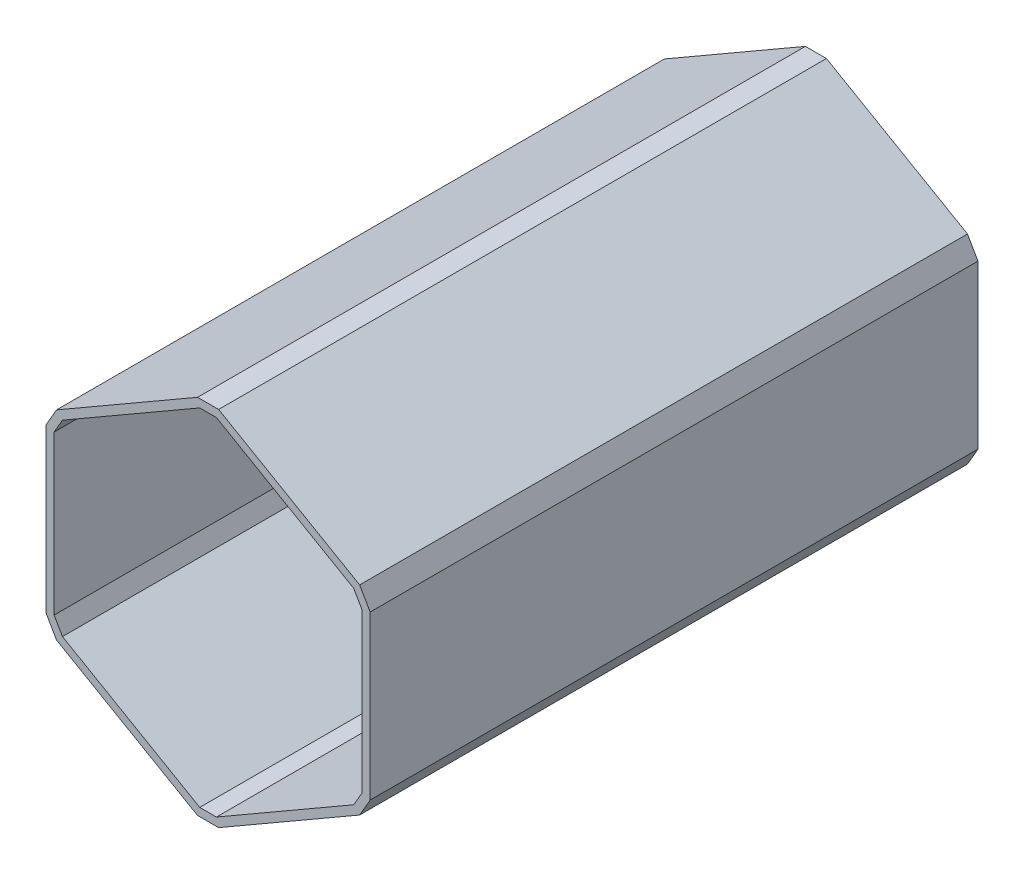
ISO-10303-21;
HEADER;
FILE_DESCRIPTION(('STEP AP214'),'2;1');
FILE_NAME('part.step','',(''),(''),'','','');
FILE_SCHEMA(('AUTOMOTIVE_DESIGN { 1 0 10303 214 1 1 1 1 }'));
ENDSEC;
DATA;
#1=APPLICATION_CONTEXT('core data for automotive mechanical design processes');
#2=APPLICATION_PROTOCOL_DEFINITION('international standard','automotive_design',2000,#1);
#3=PRODUCT_CONTEXT('',#1,'mechanical');
#4=PRODUCT('Part','Part','',(#3));
#5=PRODUCT_RELATED_PRODUCT_CATEGORY('part','',(#4));
#6=PRODUCT_DEFINITION_FORMATION('','',#4);
#7=PRODUCT_DEFINITION_CONTEXT('part definition',#1,'design');
#8=PRODUCT_DEFINITION('design','',#6,#7);
#9=PRODUCT_DEFINITION_SHAPE('','',#8);
#10=(LENGTH_UNIT() NAMED_UNIT(*) SI_UNIT(.MILLI.,.METRE.));
#11=(NAMED_UNIT(*) PLANE_ANGLE_UNIT() SI_UNIT($,.RADIAN.));
#12=(NAMED_UNIT(*) SI_UNIT($,.STERADIAN.) SOLID_ANGLE_UNIT());
#13=UNCERTAINTY_MEASURE_WITH_UNIT(LENGTH_MEASURE(1.E-05),#10,'distance_accuracy_value','');
#14=(GEOMETRIC_REPRESENTATION_CONTEXT(3) GLOBAL_UNCERTAINTY_ASSIGNED_CONTEXT((#13)) GLOBAL_UNIT_ASSIGNED_CONTEXT((#10,
#11,#12)) REPRESENTATION_CONTEXT('',''));
#15=CARTESIAN_POINT('',(0.,0.,0.));
#16=DIRECTION('',(0.,0.,1.));
#17=DIRECTION('',(1.,0.,0.));
#18=AXIS2_PLACEMENT_3D('',#15,#16,#17);
#19=CARTESIAN_POINT('',(0.,0.,150.));
#20=DIRECTION('',(0.,0.,1.));
#21=DIRECTION('',(1.,0.,0.));
#22=AXIS2_PLACEMENT_3D('',#19,#20,#21);
#23=PLANE('',#22);
#24=DIRECTION('',(-0.866025403784439,0.499999999999999,0.));
#25=VECTOR('',#24,1.);
#26=CARTESIAN_POINT('',(37.4019237886467,24.5940107675851,150.));
#27=LINE('',#26,#25);
#28=CARTESIAN_POINT('',(37.4019237886467,24.5940107675851,150.));
#29=VERTEX_POINT('',#28);
#30=CARTESIAN_POINT('',(2.59807621135332,44.6880215351701,150.));
#31=VERTEX_POINT('',#30);
#32=EDGE_CURVE('E288',#29,#31,#27,.T.);
#33=ORIENTED_EDGE('',*,*,#32,.T.);
#34=DIRECTION('',(-1.,0.,0.));
#35=VECTOR('',#34,1.);
#36=CARTESIAN_POINT('',(2.59807621135332,44.6880215351701,150.));
#37=LINE('',#36,#35);
#38=CARTESIAN_POINT('',(-2.59807621135332,44.6880215351701,150.));
#39=VERTEX_POINT('',#38);
#40=EDGE_CURVE('E291',#31,#39,#37,.T.);
#41=ORIENTED_EDGE('',*,*,#40,.T.);
#42=DIRECTION('',(-0.866025403784439,-0.5,0.));
#43=VECTOR('',#42,1.);
#44=CARTESIAN_POINT('',(-2.59807621135332,44.6880215351701,150.));
#45=LINE('',#44,#43);
#46=CARTESIAN_POINT('',(-37.4019237886467,24.5940107675851,150.));
#47=VERTEX_POINT('',#46);
#48=EDGE_CURVE('E294',#39,#47,#45,.T.);
#49=ORIENTED_EDGE('',*,*,#48,.T.);
#50=DIRECTION('',(-0.5,-0.866025403784439,0.));
#51=VECTOR('',#50,1.);
#52=CARTESIAN_POINT('',(-37.4019237886467,24.5940107675851,150.));
#53=LINE('',#52,#51);
#54=CARTESIAN_POINT('',(-40.,20.0940107675851,150.));
#55=VERTEX_POINT('',#54);
#56=EDGE_CURVE('E296',#47,#55,#53,.T.);
#57=ORIENTED_EDGE('',*,*,#56,.T.);
#58=DIRECTION('',(0.,-1.,0.));
#59=VECTOR('',#58,1.);
#60=CARTESIAN_POINT('',(-40.,20.0940107675851,150.));
#61=LINE('',#60,#59);
#62=CARTESIAN_POINT('',(-40.,-20.094010767585,150.));
#63=VERTEX_POINT('',#62);
#64=EDGE_CURVE('E298',#55,#63,#61,.T.);
#65=ORIENTED_EDGE('',*,*,#64,.T.);
#66=DIRECTION('',(0.5,-0.866025403784439,0.));
#67=VECTOR('',#66,1.);
#68=CARTESIAN_POINT('',(-40.,-20.094010767585,150.));
#69=LINE('',#68,#67);
#70=CARTESIAN_POINT('',(-37.4019237886467,-24.594010767585,150.));
#71=VERTEX_POINT('',#70);
#72=EDGE_CURVE('E300',#63,#71,#69,.T.);
#73=ORIENTED_EDGE('',*,*,#72,.T.);
#74=DIRECTION('',(0.866025403784439,-0.5,0.));
#75=VECTOR('',#74,1.);
#76=CARTESIAN_POINT('',(-37.4019237886467,-24.594010767585,150.));
#77=LINE('',#76,#75);
#78=CARTESIAN_POINT('',(-2.59807621135333,-44.6880215351701,150.));
#79=VERTEX_POINT('',#78);
#80=EDGE_CURVE('E302',#71,#79,#77,.T.);
#81=ORIENTED_EDGE('',*,*,#80,.T.);
#82=DIRECTION('',(1.,0.,0.));
#83=VECTOR('',#82,1.);
#84=CARTESIAN_POINT('',(-2.59807621135333,-44.6880215351701,150.));
#85=LINE('',#84,#83);
#86=CARTESIAN_POINT('',(2.59807621135331,-44.6880215351701,150.));
#87=VERTEX_POINT('',#86);
#88=EDGE_CURVE('E304',#79,#87,#85,.T.);
#89=ORIENTED_EDGE('',*,*,#88,.T.);
#90=DIRECTION('',(0.866025403784439,0.5,0.));
#91=VECTOR('',#90,1.);
#92=CARTESIAN_POINT('',(2.59807621135331,-44.6880215351701,150.));
#93=LINE('',#92,#91);
#94=CARTESIAN_POINT('',(37.4019237886467,-24.5940107675851,150.));
#95=VERTEX_POINT('',#94);
#96=EDGE_CURVE('E306',#87,#95,#93,.T.);
#97=ORIENTED_EDGE('',*,*,#96,.T.);
#98=DIRECTION('',(0.5,0.866025403784439,0.));
#99=VECTOR('',#98,1.);
#100=CARTESIAN_POINT('',(37.4019237886467,-24.5940107675851,150.));
#101=LINE('',#100,#99);
#102=CARTESIAN_POINT('',(40.,-20.0940107675851,150.));
#103=VERTEX_POINT('',#102);
#104=EDGE_CURVE('E308',#95,#103,#101,.T.);
#105=ORIENTED_EDGE('',*,*,#104,.T.);
#106=DIRECTION('',(0.,1.,0.));
#107=VECTOR('',#106,1.);
#108=CARTESIAN_POINT('',(40.,-20.0940107675851,150.));
#109=LINE('',#108,#107);
#110=CARTESIAN_POINT('',(40.,20.0940107675851,150.));
#111=VERTEX_POINT('',#110);
#112=EDGE_CURVE('E310',#103,#111,#109,.T.);
#113=ORIENTED_EDGE('',*,*,#112,.T.);
#114=DIRECTION('',(-0.5,0.866025403784439,0.));
#115=VECTOR('',#114,1.);
#116=CARTESIAN_POINT('',(40.,20.0940107675851,150.));
#117=LINE('',#116,#115);
#118=EDGE_CURVE('E312',#111,#29,#117,.T.);
#119=ORIENTED_EDGE('',*,*,#118,.T.);
#120=EDGE_LOOP('',(#33,#41,#49,#57,#65,#73,#81,#89,#97,#105,#113,#119));
#121=FACE_BOUND('',#120,.T.);
#122=DIRECTION('',(-0.866025403784439,-0.5,0.));
#123=VECTOR('',#122,1.);
#124=CARTESIAN_POINT('',(-2.06217782649109,42.68802153517,150.));
#125=LINE('',#124,#123);
#126=CARTESIAN_POINT('',(-2.06217782649109,42.68802153517,150.));
#127=VERTEX_POINT('',#126);
#128=CARTESIAN_POINT('',(-35.937822173509,23.1299091524473,150.));
#129=VERTEX_POINT('',#128);
#130=EDGE_CURVE('E203',#127,#129,#125,.T.);
#131=ORIENTED_EDGE('',*,*,#130,.F.);
#132=DIRECTION('',(-1.,0.,0.));
#133=VECTOR('',#132,1.);
#134=CARTESIAN_POINT('',(2.06217782649112,42.68802153517,150.));
#135=LINE('',#134,#133);
#136=CARTESIAN_POINT('',(2.06217782649112,42.68802153517,150.));
#137=VERTEX_POINT('',#136);
#138=EDGE_CURVE('E195',#137,#127,#135,.T.);
#139=ORIENTED_EDGE('',*,*,#138,.F.);
#140=DIRECTION('',(-0.866025403784439,0.5,0.));
#141=VECTOR('',#140,1.);
#142=CARTESIAN_POINT('',(35.9378221735089,23.1299091524473,150.));
#143=LINE('',#142,#141);
#144=CARTESIAN_POINT('',(35.9378221735089,23.1299091524473,150.));
#145=VERTEX_POINT('',#144);
#146=EDGE_CURVE('E236',#145,#137,#143,.T.);
#147=ORIENTED_EDGE('',*,*,#146,.F.);
#148=DIRECTION('',(-0.5,0.866025403784439,0.));
#149=VECTOR('',#148,1.);
#150=CARTESIAN_POINT('',(38.,19.5581123827228,150.));
#151=LINE('',#150,#149);
#152=CARTESIAN_POINT('',(38.,19.5581123827228,150.));
#153=VERTEX_POINT('',#152);
#154=EDGE_CURVE('E234',#153,#145,#151,.T.);
#155=ORIENTED_EDGE('',*,*,#154,.F.);
#156=DIRECTION('',(0.,1.,0.));
#157=VECTOR('',#156,1.);
#158=CARTESIAN_POINT('',(38.,-19.5581123827228,150.));
#159=LINE('',#158,#157);
#160=CARTESIAN_POINT('',(38.,-19.5581123827228,150.));
#161=VERTEX_POINT('',#160);
#162=EDGE_CURVE('E232',#161,#153,#159,.T.);
#163=ORIENTED_EDGE('',*,*,#162,.F.);
#164=DIRECTION('',(0.5,0.866025403784439,0.));
#165=VECTOR('',#164,1.);
#166=CARTESIAN_POINT('',(35.9378221735089,-23.1299091524473,150.));
#167=LINE('',#166,#165);
#168=CARTESIAN_POINT('',(35.9378221735089,-23.1299091524473,150.));
#169=VERTEX_POINT('',#168);
#170=EDGE_CURVE('E230',#169,#161,#167,.T.);
#171=ORIENTED_EDGE('',*,*,#170,.F.);
#172=DIRECTION('',(0.866025403784438,0.5,0.));
#173=VECTOR('',#172,1.);
#174=CARTESIAN_POINT('',(2.06217782649106,-42.6880215351701,150.));
#175=LINE('',#174,#173);
#176=CARTESIAN_POINT('',(2.06217782649106,-42.6880215351701,150.));
#177=VERTEX_POINT('',#176);
#178=EDGE_CURVE('E228',#177,#169,#175,.T.);
#179=ORIENTED_EDGE('',*,*,#178,.F.);
#180=DIRECTION('',(1.,0.,0.));
#181=VECTOR('',#180,1.);
#182=CARTESIAN_POINT('',(-2.06217782649108,-42.6880215351701,150.));
#183=LINE('',#182,#181);
#184=CARTESIAN_POINT('',(-2.06217782649108,-42.6880215351701,150.));
#185=VERTEX_POINT('',#184);
#186=EDGE_CURVE('E226',#185,#177,#183,.T.);
#187=ORIENTED_EDGE('',*,*,#186,.F.);
#188=DIRECTION('',(0.866025403784439,-0.5,0.));
#189=VECTOR('',#188,1.);
#190=CARTESIAN_POINT('',(-35.9378221735089,-23.1299091524473,150.));
#191=LINE('',#190,#189);
#192=CARTESIAN_POINT('',(-35.9378221735089,-23.1299091524473,150.));
#193=VERTEX_POINT('',#192);
#194=EDGE_CURVE('E224',#193,#185,#191,.T.);
#195=ORIENTED_EDGE('',*,*,#194,.F.);
#196=DIRECTION('',(0.5,-0.866025403784439,0.));
#197=VECTOR('',#196,1.);
#198=CARTESIAN_POINT('',(-38.,-19.5581123827228,150.));
#199=LINE('',#198,#197);
#200=CARTESIAN_POINT('',(-38.,-19.5581123827228,150.));
#201=VERTEX_POINT('',#200);
#202=EDGE_CURVE('E222',#201,#193,#199,.T.);
#203=ORIENTED_EDGE('',*,*,#202,.F.);
#204=DIRECTION('',(0.,-1.,0.));
#205=VECTOR('',#204,1.);
#206=CARTESIAN_POINT('',(-38.,19.5581123827228,150.));
#207=LINE('',#206,#205);
#208=CARTESIAN_POINT('',(-38.,19.5581123827228,150.));
#209=VERTEX_POINT('',#208);
#210=EDGE_CURVE('E218',#209,#201,#207,.T.);
#211=ORIENTED_EDGE('',*,*,#210,.F.);
#212=DIRECTION('',(-0.5,-0.866025403784439,0.));
#213=VECTOR('',#212,1.);
#214=CARTESIAN_POINT('',(-35.937822173509,23.1299091524473,150.));
#215=LINE('',#214,#213);
#216=EDGE_CURVE('E216',#129,#209,#215,.T.);
#217=ORIENTED_EDGE('',*,*,#216,.F.);
#218=EDGE_LOOP('',(#131,#139,#147,#155,#163,#171,#179,#187,#195,#203,#211,#217));
#219=FACE_BOUND('',#218,.T.);
#220=ADVANCED_FACE('F34',(#121,#219),#23,.T.);
#221=CARTESIAN_POINT('',(0.,0.,0.));
#222=DIRECTION('',(0.,0.,1.));
#223=DIRECTION('',(1.,0.,0.));
#224=AXIS2_PLACEMENT_3D('',#221,#222,#223);
#225=PLANE('',#224);
#226=DIRECTION('',(-0.866025403784439,0.499999999999999,0.));
#227=VECTOR('',#226,1.);
#228=CARTESIAN_POINT('',(37.4019237886467,24.5940107675851,0.));
#229=LINE('',#228,#227);
#230=CARTESIAN_POINT('',(37.4019237886467,24.5940107675851,0.));
#231=VERTEX_POINT('',#230);
#232=CARTESIAN_POINT('',(2.59807621135332,44.6880215351701,0.));
#233=VERTEX_POINT('',#232);
#234=EDGE_CURVE('E211',#231,#233,#229,.T.);
#235=ORIENTED_EDGE('',*,*,#234,.F.);
#236=DIRECTION('',(-0.5,0.866025403784439,0.));
#237=VECTOR('',#236,1.);
#238=CARTESIAN_POINT('',(40.,20.0940107675851,0.));
#239=LINE('',#238,#237);
#240=CARTESIAN_POINT('',(40.,20.0940107675851,0.));
#241=VERTEX_POINT('',#240);
#242=EDGE_CURVE('E292',#241,#231,#239,.T.);
#243=ORIENTED_EDGE('',*,*,#242,.F.);
#244=DIRECTION('',(0.,1.,0.));
#245=VECTOR('',#244,1.);
#246=CARTESIAN_POINT('',(40.,-20.0940107675851,0.));
#247=LINE('',#246,#245);
#248=CARTESIAN_POINT('',(40.,-20.0940107675851,0.));
#249=VERTEX_POINT('',#248);
#250=EDGE_CURVE('E335',#249,#241,#247,.T.);
#251=ORIENTED_EDGE('',*,*,#250,.F.);
#252=DIRECTION('',(0.5,0.866025403784439,0.));
#253=VECTOR('',#252,1.);
#254=CARTESIAN_POINT('',(37.4019237886467,-24.5940107675851,0.));
#255=LINE('',#254,#253);
#256=CARTESIAN_POINT('',(37.4019237886467,-24.5940107675851,0.));
#257=VERTEX_POINT('',#256);
#258=EDGE_CURVE('E333',#257,#249,#255,.T.);
#259=ORIENTED_EDGE('',*,*,#258,.F.);
#260=DIRECTION('',(0.866025403784439,0.5,0.));
#261=VECTOR('',#260,1.);
#262=CARTESIAN_POINT('',(2.59807621135331,-44.6880215351701,0.));
#263=LINE('',#262,#261);
#264=CARTESIAN_POINT('',(2.59807621135331,-44.6880215351701,0.));
#265=VERTEX_POINT('',#264);
#266=EDGE_CURVE('E331',#265,#257,#263,.T.);
#267=ORIENTED_EDGE('',*,*,#266,.F.);
#268=DIRECTION('',(1.,0.,0.));
#269=VECTOR('',#268,1.);
#270=CARTESIAN_POINT('',(-2.59807621135333,-44.6880215351701,0.));
#271=LINE('',#270,#269);
#272=CARTESIAN_POINT('',(-2.59807621135333,-44.6880215351701,0.));
#273=VERTEX_POINT('',#272);
#274=EDGE_CURVE('E329',#273,#265,#271,.T.);
#275=ORIENTED_EDGE('',*,*,#274,.F.);
#276=DIRECTION('',(0.866025403784439,-0.5,0.));
#277=VECTOR('',#276,1.);
#278=CARTESIAN_POINT('',(-37.4019237886467,-24.594010767585,0.));
#279=LINE('',#278,#277);
#280=CARTESIAN_POINT('',(-37.4019237886467,-24.594010767585,0.));
#281=VERTEX_POINT('',#280);
#282=EDGE_CURVE('E327',#281,#273,#279,.T.);
#283=ORIENTED_EDGE('',*,*,#282,.F.);
#284=DIRECTION('',(0.5,-0.866025403784439,0.));
#285=VECTOR('',#284,1.);
#286=CARTESIAN_POINT('',(-40.,-20.094010767585,0.));
#287=LINE('',#286,#285);
#288=CARTESIAN_POINT('',(-40.,-20.094010767585,0.));
#289=VERTEX_POINT('',#288);
#290=EDGE_CURVE('E325',#289,#281,#287,.T.);
#291=ORIENTED_EDGE('',*,*,#290,.F.);
#292=DIRECTION('',(0.,-1.,0.));
#293=VECTOR('',#292,1.);
#294=CARTESIAN_POINT('',(-40.,20.0940107675851,0.));
#295=LINE('',#294,#293);
#296=CARTESIAN_POINT('',(-40.,20.0940107675851,0.));
#297=VERTEX_POINT('',#296);
#298=EDGE_CURVE('E323',#297,#289,#295,.T.);
#299=ORIENTED_EDGE('',*,*,#298,.F.);
#300=DIRECTION('',(-0.5,-0.866025403784439,0.));
#301=VECTOR('',#300,1.);
#302=CARTESIAN_POINT('',(-37.4019237886467,24.5940107675851,0.));
#303=LINE('',#302,#301);
#304=CARTESIAN_POINT('',(-37.4019237886467,24.5940107675851,0.));
#305=VERTEX_POINT('',#304);
#306=EDGE_CURVE('E321',#305,#297,#303,.T.);
#307=ORIENTED_EDGE('',*,*,#306,.F.);
#308=DIRECTION('',(-0.866025403784439,-0.5,0.));
#309=VECTOR('',#308,1.);
#310=CARTESIAN_POINT('',(-2.59807621135332,44.6880215351701,0.));
#311=LINE('',#310,#309);
#312=CARTESIAN_POINT('',(-2.59807621135332,44.6880215351701,0.));
#313=VERTEX_POINT('',#312);
#314=EDGE_CURVE('E319',#313,#305,#311,.T.);
#315=ORIENTED_EDGE('',*,*,#314,.F.);
#316=DIRECTION('',(-1.,0.,0.));
#317=VECTOR('',#316,1.);
#318=CARTESIAN_POINT('',(2.59807621135332,44.6880215351701,0.));
#319=LINE('',#318,#317);
#320=EDGE_CURVE('E317',#233,#313,#319,.T.);
#321=ORIENTED_EDGE('',*,*,#320,.F.);
#322=EDGE_LOOP('',(#235,#243,#251,#259,#267,#275,#283,#291,#299,#307,#315,#321));
#323=FACE_BOUND('',#322,.T.);
#324=DIRECTION('',(-1.,0.,0.));
#325=VECTOR('',#324,1.);
#326=CARTESIAN_POINT('',(2.06217782649112,42.68802153517,0.));
#327=LINE('',#326,#325);
#328=CARTESIAN_POINT('',(2.06217782649112,42.68802153517,0.));
#329=VERTEX_POINT('',#328);
#330=CARTESIAN_POINT('',(-2.06217782649109,42.68802153517,0.));
#331=VERTEX_POINT('',#330);
#332=EDGE_CURVE('E57',#329,#331,#327,.T.);
#333=ORIENTED_EDGE('',*,*,#332,.T.);
#334=DIRECTION('',(-0.866025403784439,-0.5,0.));
#335=VECTOR('',#334,1.);
#336=CARTESIAN_POINT('',(-2.06217782649109,42.68802153517,0.));
#337=LINE('',#336,#335);
#338=CARTESIAN_POINT('',(-35.937822173509,23.1299091524473,0.));
#339=VERTEX_POINT('',#338);
#340=EDGE_CURVE('E210',#331,#339,#337,.T.);
#341=ORIENTED_EDGE('',*,*,#340,.T.);
#342=DIRECTION('',(-0.5,-0.866025403784439,0.));
#343=VECTOR('',#342,1.);
#344=CARTESIAN_POINT('',(-35.937822173509,23.1299091524473,0.));
#345=LINE('',#344,#343);
#346=CARTESIAN_POINT('',(-38.,19.5581123827228,0.));
#347=VERTEX_POINT('',#346);
#348=EDGE_CURVE('E240',#339,#347,#345,.T.);
#349=ORIENTED_EDGE('',*,*,#348,.T.);
#350=DIRECTION('',(0.,-1.,0.));
#351=VECTOR('',#350,1.);
#352=CARTESIAN_POINT('',(-38.,19.5581123827228,0.));
#353=LINE('',#352,#351);
#354=CARTESIAN_POINT('',(-38.,-19.5581123827228,0.));
#355=VERTEX_POINT('',#354);
#356=EDGE_CURVE('E243',#347,#355,#353,.T.);
#357=ORIENTED_EDGE('',*,*,#356,.T.);
#358=DIRECTION('',(0.5,-0.866025403784439,0.));
#359=VECTOR('',#358,1.);
#360=CARTESIAN_POINT('',(-38.,-19.5581123827228,0.));
#361=LINE('',#360,#359);
#362=CARTESIAN_POINT('',(-35.9378221735089,-23.1299091524473,0.));
#363=VERTEX_POINT('',#362);
#364=EDGE_CURVE('E246',#355,#363,#361,.T.);
#365=ORIENTED_EDGE('',*,*,#364,.T.);
#366=DIRECTION('',(0.866025403784439,-0.5,0.));
#367=VECTOR('',#366,1.);
#368=CARTESIAN_POINT('',(-35.9378221735089,-23.1299091524473,0.));
#369=LINE('',#368,#367);
#370=CARTESIAN_POINT('',(-2.06217782649108,-42.6880215351701,0.));
#371=VERTEX_POINT('',#370);
#372=EDGE_CURVE('E249',#363,#371,#369,.T.);
#373=ORIENTED_EDGE('',*,*,#372,.T.);
#374=DIRECTION('',(1.,0.,0.));
#375=VECTOR('',#374,1.);
#376=CARTESIAN_POINT('',(-2.06217782649108,-42.6880215351701,0.));
#377=LINE('',#376,#375);
#378=CARTESIAN_POINT('',(2.06217782649106,-42.6880215351701,0.));
#379=VERTEX_POINT('',#378);
#380=EDGE_CURVE('E252',#371,#379,#377,.T.);
#381=ORIENTED_EDGE('',*,*,#380,.T.);
#382=DIRECTION('',(0.866025403784438,0.5,0.));
#383=VECTOR('',#382,1.);
#384=CARTESIAN_POINT('',(2.06217782649106,-42.6880215351701,0.));
#385=LINE('',#384,#383);
#386=CARTESIAN_POINT('',(35.9378221735089,-23.1299091524473,0.));
#387=VERTEX_POINT('',#386);
#388=EDGE_CURVE('E255',#379,#387,#385,.T.);
#389=ORIENTED_EDGE('',*,*,#388,.T.);
#390=DIRECTION('',(0.5,0.866025403784439,0.));
#391=VECTOR('',#390,1.);
#392=CARTESIAN_POINT('',(35.9378221735089,-23.1299091524473,0.));
#393=LINE('',#392,#391);
#394=CARTESIAN_POINT('',(38.,-19.5581123827228,0.));
#395=VERTEX_POINT('',#394);
#396=EDGE_CURVE('E258',#387,#395,#393,.T.);
#397=ORIENTED_EDGE('',*,*,#396,.T.);
#398=DIRECTION('',(0.,1.,0.));
#399=VECTOR('',#398,1.);
#400=CARTESIAN_POINT('',(38.,-19.5581123827228,0.));
#401=LINE('',#400,#399);
#402=CARTESIAN_POINT('',(38.,19.5581123827228,0.));
#403=VERTEX_POINT('',#402);
#404=EDGE_CURVE('E261',#395,#403,#401,.T.);
#405=ORIENTED_EDGE('',*,*,#404,.T.);
#406=DIRECTION('',(-0.5,0.866025403784439,0.));
#407=VECTOR('',#406,1.);
#408=CARTESIAN_POINT('',(38.,19.5581123827228,0.));
#409=LINE('',#408,#407);
#410=CARTESIAN_POINT('',(35.9378221735089,23.1299091524473,0.));
#411=VERTEX_POINT('',#410);
#412=EDGE_CURVE('E264',#403,#411,#409,.T.);
#413=ORIENTED_EDGE('',*,*,#412,.T.);
#414=DIRECTION('',(-0.866025403784439,0.5,0.));
#415=VECTOR('',#414,1.);
#416=CARTESIAN_POINT('',(35.9378221735089,23.1299091524473,0.));
#417=LINE('',#416,#415);
#418=EDGE_CURVE('E204',#411,#329,#417,.T.);
#419=ORIENTED_EDGE('',*,*,#418,.T.);
#420=EDGE_LOOP('',(#333,#341,#349,#357,#365,#373,#381,#389,#397,#405,#413,#419));
#421=FACE_BOUND('',#420,.T.);
#422=ADVANCED_FACE('F377',(#323,#421),#225,.F.);
#423=CARTESIAN_POINT('',(37.4019237886467,24.5940107675851,150.));
#424=DIRECTION('',(-0.499999999999999,-0.866025403784439,0.));
#425=DIRECTION('',(0.866025403784439,-0.5,0.));
#426=AXIS2_PLACEMENT_3D('',#423,#424,#425);
#427=PLANE('',#426);
#428=ORIENTED_EDGE('',*,*,#234,.T.);
#429=DIRECTION('',(0.,0.,-1.));
#430=VECTOR('',#429,1.);
#431=CARTESIAN_POINT('',(2.59807621135332,44.6880215351701,150.));
#432=LINE('',#431,#430);
#433=EDGE_CURVE('E11',#31,#233,#432,.T.);
#434=ORIENTED_EDGE('',*,*,#433,.F.);
#435=ORIENTED_EDGE('',*,*,#32,.F.);
#436=DIRECTION('',(0.,0.,-1.));
#437=VECTOR('',#436,1.);
#438=CARTESIAN_POINT('',(37.4019237886467,24.5940107675851,150.));
#439=LINE('',#438,#437);
#440=EDGE_CURVE('E314',#29,#231,#439,.T.);
#441=ORIENTED_EDGE('',*,*,#440,.T.);
#442=EDGE_LOOP('',(#428,#434,#435,#441));
#443=FACE_BOUND('',#442,.T.);
#444=ADVANCED_FACE('F36',(#443),#427,.F.);
#445=CARTESIAN_POINT('',(2.59807621135332,44.6880215351701,150.));
#446=DIRECTION('',(0.,-1.,0.));
#447=DIRECTION('',(1.,0.,0.));
#448=AXIS2_PLACEMENT_3D('',#445,#446,#447);
#449=PLANE('',#448);
#450=ORIENTED_EDGE('',*,*,#320,.T.);
#451=DIRECTION('',(0.,0.,-1.));
#452=VECTOR('',#451,1.);
#453=CARTESIAN_POINT('',(-2.59807621135332,44.6880215351701,150.));
#454=LINE('',#453,#452);
#455=EDGE_CURVE('E42',#39,#313,#454,.T.);
#456=ORIENTED_EDGE('',*,*,#455,.F.);
#457=ORIENTED_EDGE('',*,*,#40,.F.);
#458=ORIENTED_EDGE('',*,*,#433,.T.);
#459=EDGE_LOOP('',(#450,#456,#457,#458));
#460=FACE_BOUND('',#459,.T.);
#461=ADVANCED_FACE('F394',(#460),#449,.F.);
#462=CARTESIAN_POINT('',(-2.59807621135332,44.6880215351701,150.));
#463=DIRECTION('',(0.5,-0.866025403784439,0.));
#464=DIRECTION('',(0.866025403784439,0.5,0.));
#465=AXIS2_PLACEMENT_3D('',#462,#463,#464);
#466=PLANE('',#465);
#467=ORIENTED_EDGE('',*,*,#314,.T.);
#468=DIRECTION('',(0.,0.,-1.));
#469=VECTOR('',#468,1.);
#470=CARTESIAN_POINT('',(-37.4019237886467,24.5940107675851,150.));
#471=LINE('',#470,#469);
#472=EDGE_CURVE('E364',#47,#305,#471,.T.);
#473=ORIENTED_EDGE('',*,*,#472,.F.);
#474=ORIENTED_EDGE('',*,*,#48,.F.);
#475=ORIENTED_EDGE('',*,*,#455,.T.);
#476=EDGE_LOOP('',(#467,#473,#474,#475));
#477=FACE_BOUND('',#476,.T.);
#478=ADVANCED_FACE('F371',(#477),#466,.F.);
#479=CARTESIAN_POINT('',(-37.4019237886467,24.5940107675851,150.));
#480=DIRECTION('',(0.866025403784439,-0.5,0.));
#481=DIRECTION('',(0.5,0.866025403784439,0.));
#482=AXIS2_PLACEMENT_3D('',#479,#480,#481);
#483=PLANE('',#482);
#484=ORIENTED_EDGE('',*,*,#306,.T.);
#485=DIRECTION('',(0.,0.,-1.));
#486=VECTOR('',#485,1.);
#487=CARTESIAN_POINT('',(-40.,20.0940107675851,150.));
#488=LINE('',#487,#486);
#489=EDGE_CURVE('E361',#55,#297,#488,.T.);
#490=ORIENTED_EDGE('',*,*,#489,.F.);
#491=ORIENTED_EDGE('',*,*,#56,.F.);
#492=ORIENTED_EDGE('',*,*,#472,.T.);
#493=EDGE_LOOP('',(#484,#490,#491,#492));
#494=FACE_BOUND('',#493,.T.);
#495=ADVANCED_FACE('F383',(#494),#483,.F.);
#496=CARTESIAN_POINT('',(-40.,20.0940107675851,150.));
#497=DIRECTION('',(1.,0.,0.));
#498=DIRECTION('',(0.,0.,-1.));
#499=AXIS2_PLACEMENT_3D('',#496,#497,#498);
#500=PLANE('',#499);
#501=ORIENTED_EDGE('',*,*,#298,.T.);
#502=DIRECTION('',(0.,0.,-1.));
#503=VECTOR('',#502,1.);
#504=CARTESIAN_POINT('',(-40.,-20.094010767585,150.));
#505=LINE('',#504,#503);
#506=EDGE_CURVE('E358',#63,#289,#505,.T.);
#507=ORIENTED_EDGE('',*,*,#506,.F.);
#508=ORIENTED_EDGE('',*,*,#64,.F.);
#509=ORIENTED_EDGE('',*,*,#489,.T.);
#510=EDGE_LOOP('',(#501,#507,#508,#509));
#511=FACE_BOUND('',#510,.T.);
#512=ADVANCED_FACE('F387',(#511),#500,.F.);
#513=CARTESIAN_POINT('',(-40.,-20.094010767585,150.));
#514=DIRECTION('',(0.866025403784439,0.5,0.));
#515=DIRECTION('',(-0.5,0.866025403784439,0.));
#516=AXIS2_PLACEMENT_3D('',#513,#514,#515);
#517=PLANE('',#516);
#518=ORIENTED_EDGE('',*,*,#290,.T.);
#519=DIRECTION('',(0.,0.,-1.));
#520=VECTOR('',#519,1.);
#521=CARTESIAN_POINT('',(-37.4019237886467,-24.594010767585,150.));
#522=LINE('',#521,#520);
#523=EDGE_CURVE('E355',#71,#281,#522,.T.);
#524=ORIENTED_EDGE('',*,*,#523,.F.);
#525=ORIENTED_EDGE('',*,*,#72,.F.);
#526=ORIENTED_EDGE('',*,*,#506,.T.);
#527=EDGE_LOOP('',(#518,#524,#525,#526));
#528=FACE_BOUND('',#527,.T.);
#529=ADVANCED_FACE('F427',(#528),#517,.F.);
#530=CARTESIAN_POINT('',(-37.4019237886467,-24.594010767585,150.));
#531=DIRECTION('',(0.5,0.866025403784439,0.));
#532=DIRECTION('',(-0.866025403784439,0.5,0.));
#533=AXIS2_PLACEMENT_3D('',#530,#531,#532);
#534=PLANE('',#533);
#535=ORIENTED_EDGE('',*,*,#282,.T.);
#536=DIRECTION('',(0.,0.,-1.));
#537=VECTOR('',#536,1.);
#538=CARTESIAN_POINT('',(-2.59807621135333,-44.6880215351701,150.));
#539=LINE('',#538,#537);
#540=EDGE_CURVE('E352',#79,#273,#539,.T.);
#541=ORIENTED_EDGE('',*,*,#540,.F.);
#542=ORIENTED_EDGE('',*,*,#80,.F.);
#543=ORIENTED_EDGE('',*,*,#523,.T.);
#544=EDGE_LOOP('',(#535,#541,#542,#543));
#545=FACE_BOUND('',#544,.T.);
#546=ADVANCED_FACE('F425',(#545),#534,.F.);
#547=CARTESIAN_POINT('',(-2.59807621135333,-44.6880215351701,150.));
#548=DIRECTION('',(0.,1.,0.));
#549=DIRECTION('',(0.,0.,1.));
#550=AXIS2_PLACEMENT_3D('',#547,#548,#549);
#551=PLANE('',#550);
#552=ORIENTED_EDGE('',*,*,#274,.T.);
#553=DIRECTION('',(0.,0.,-1.));
#554=VECTOR('',#553,1.);
#555=CARTESIAN_POINT('',(2.59807621135331,-44.6880215351701,150.));
#556=LINE('',#555,#554);
#557=EDGE_CURVE('E349',#87,#265,#556,.T.);
#558=ORIENTED_EDGE('',*,*,#557,.F.);
#559=ORIENTED_EDGE('',*,*,#88,.F.);
#560=ORIENTED_EDGE('',*,*,#540,.T.);
#561=EDGE_LOOP('',(#552,#558,#559,#560));
#562=FACE_BOUND('',#561,.T.);
#563=ADVANCED_FACE('F421',(#562),#551,.F.);
#564=CARTESIAN_POINT('',(2.59807621135331,-44.6880215351701,150.));
#565=DIRECTION('',(-0.5,0.866025403784439,0.));
#566=DIRECTION('',(-0.866025403784439,-0.5,0.));
#567=AXIS2_PLACEMENT_3D('',#564,#565,#566);
#568=PLANE('',#567);
#569=ORIENTED_EDGE('',*,*,#266,.T.);
#570=DIRECTION('',(0.,0.,-1.));
#571=VECTOR('',#570,1.);
#572=CARTESIAN_POINT('',(37.4019237886467,-24.5940107675851,150.));
#573=LINE('',#572,#571);
#574=EDGE_CURVE('E346',#95,#257,#573,.T.);
#575=ORIENTED_EDGE('',*,*,#574,.F.);
#576=ORIENTED_EDGE('',*,*,#96,.F.);
#577=ORIENTED_EDGE('',*,*,#557,.T.);
#578=EDGE_LOOP('',(#569,#575,#576,#577));
#579=FACE_BOUND('',#578,.T.);
#580=ADVANCED_FACE('F416',(#579),#568,.F.);
#581=CARTESIAN_POINT('',(37.4019237886467,-24.5940107675851,150.));
#582=DIRECTION('',(-0.866025403784439,0.5,0.));
#583=DIRECTION('',(-0.5,-0.866025403784439,0.));
#584=AXIS2_PLACEMENT_3D('',#581,#582,#583);
#585=PLANE('',#584);
#586=ORIENTED_EDGE('',*,*,#258,.T.);
#587=DIRECTION('',(0.,0.,-1.));
#588=VECTOR('',#587,1.);
#589=CARTESIAN_POINT('',(40.,-20.0940107675851,150.));
#590=LINE('',#589,#588);
#591=EDGE_CURVE('E343',#103,#249,#590,.T.);
#592=ORIENTED_EDGE('',*,*,#591,.F.);
#593=ORIENTED_EDGE('',*,*,#104,.F.);
#594=ORIENTED_EDGE('',*,*,#574,.T.);
#595=EDGE_LOOP('',(#586,#592,#593,#594));
#596=FACE_BOUND('',#595,.T.);
#597=ADVANCED_FACE('F410',(#596),#585,.F.);
#598=CARTESIAN_POINT('',(40.,-20.0940107675851,150.));
#599=DIRECTION('',(-1.,0.,0.));
#600=DIRECTION('',(0.,0.,1.));
#601=AXIS2_PLACEMENT_3D('',#598,#599,#600);
#602=PLANE('',#601);
#603=ORIENTED_EDGE('',*,*,#250,.T.);
#604=DIRECTION('',(0.,0.,-1.));
#605=VECTOR('',#604,1.);
#606=CARTESIAN_POINT('',(40.,20.0940107675851,150.));
#607=LINE('',#606,#605);
#608=EDGE_CURVE('E340',#111,#241,#607,.T.);
#609=ORIENTED_EDGE('',*,*,#608,.F.);
#610=ORIENTED_EDGE('',*,*,#112,.F.);
#611=ORIENTED_EDGE('',*,*,#591,.T.);
#612=EDGE_LOOP('',(#603,#609,#610,#611));
#613=FACE_BOUND('',#612,.T.);
#614=ADVANCED_FACE('F406',(#613),#602,.F.);
#615=CARTESIAN_POINT('',(40.,20.0940107675851,150.));
#616=DIRECTION('',(-0.866025403784439,-0.5,0.));
#617=DIRECTION('',(0.5,-0.866025403784439,0.));
#618=AXIS2_PLACEMENT_3D('',#615,#616,#617);
#619=PLANE('',#618);
#620=ORIENTED_EDGE('',*,*,#242,.T.);
#621=ORIENTED_EDGE('',*,*,#440,.F.);
#622=ORIENTED_EDGE('',*,*,#118,.F.);
#623=ORIENTED_EDGE('',*,*,#608,.T.);
#624=EDGE_LOOP('',(#620,#621,#622,#623));
#625=FACE_BOUND('',#624,.T.);
#626=ADVANCED_FACE('F401',(#625),#619,.F.);
#627=CARTESIAN_POINT('',(2.06217782649112,42.68802153517,150.));
#628=DIRECTION('',(0.,-1.,0.));
#629=DIRECTION('',(0.,0.,-1.));
#630=AXIS2_PLACEMENT_3D('',#627,#628,#629);
#631=PLANE('',#630);
#632=ORIENTED_EDGE('',*,*,#332,.F.);
#633=DIRECTION('',(0.,0.,-1.));
#634=VECTOR('',#633,1.);
#635=CARTESIAN_POINT('',(2.06217782649112,42.68802153517,150.));
#636=LINE('',#635,#634);
#637=EDGE_CURVE('E199',#137,#329,#636,.T.);
#638=ORIENTED_EDGE('',*,*,#637,.F.);
#639=ORIENTED_EDGE('',*,*,#138,.T.);
#640=DIRECTION('',(0.,0.,-1.));
#641=VECTOR('',#640,1.);
#642=CARTESIAN_POINT('',(-2.06217782649109,42.68802153517,150.));
#643=LINE('',#642,#641);
#644=EDGE_CURVE('E198',#127,#331,#643,.T.);
#645=ORIENTED_EDGE('',*,*,#644,.T.);
#646=EDGE_LOOP('',(#632,#638,#639,#645));
#647=FACE_BOUND('',#646,.T.);
#648=ADVANCED_FACE('F197',(#647),#631,.T.);
#649=CARTESIAN_POINT('',(-2.06217782649109,42.68802153517,150.));
#650=DIRECTION('',(0.5,-0.866025403784439,0.));
#651=DIRECTION('',(0.866025403784439,0.5,0.));
#652=AXIS2_PLACEMENT_3D('',#649,#650,#651);
#653=PLANE('',#652);
#654=ORIENTED_EDGE('',*,*,#340,.F.);
#655=ORIENTED_EDGE('',*,*,#644,.F.);
#656=ORIENTED_EDGE('',*,*,#130,.T.);
#657=DIRECTION('',(0.,0.,-1.));
#658=VECTOR('',#657,1.);
#659=CARTESIAN_POINT('',(-35.937822173509,23.1299091524473,150.));
#660=LINE('',#659,#658);
#661=EDGE_CURVE('E212',#129,#339,#660,.T.);
#662=ORIENTED_EDGE('',*,*,#661,.T.);
#663=EDGE_LOOP('',(#654,#655,#656,#662));
#664=FACE_BOUND('',#663,.T.);
#665=ADVANCED_FACE('F207',(#664),#653,.T.);
#666=CARTESIAN_POINT('',(-35.937822173509,23.1299091524473,150.));
#667=DIRECTION('',(0.866025403784439,-0.5,0.));
#668=DIRECTION('',(0.5,0.866025403784439,0.));
#669=AXIS2_PLACEMENT_3D('',#666,#667,#668);
#670=PLANE('',#669);
#671=ORIENTED_EDGE('',*,*,#348,.F.);
#672=ORIENTED_EDGE('',*,*,#661,.F.);
#673=ORIENTED_EDGE('',*,*,#216,.T.);
#674=DIRECTION('',(0.,0.,-1.));
#675=VECTOR('',#674,1.);
#676=CARTESIAN_POINT('',(-38.,19.5581123827228,150.));
#677=LINE('',#676,#675);
#678=EDGE_CURVE('E285',#209,#347,#677,.T.);
#679=ORIENTED_EDGE('',*,*,#678,.T.);
#680=EDGE_LOOP('',(#671,#672,#673,#679));
#681=FACE_BOUND('',#680,.T.);
#682=ADVANCED_FACE('F485',(#681),#670,.T.);
#683=CARTESIAN_POINT('',(-38.,19.5581123827228,150.));
#684=DIRECTION('',(1.,0.,0.));
#685=DIRECTION('',(0.,0.,-1.));
#686=AXIS2_PLACEMENT_3D('',#683,#684,#685);
#687=PLANE('',#686);
#688=ORIENTED_EDGE('',*,*,#356,.F.);
#689=ORIENTED_EDGE('',*,*,#678,.F.);
#690=ORIENTED_EDGE('',*,*,#210,.T.);
#691=DIRECTION('',(0.,0.,-1.));
#692=VECTOR('',#691,1.);
#693=CARTESIAN_POINT('',(-38.,-19.5581123827228,150.));
#694=LINE('',#693,#692);
#695=EDGE_CURVE('E283',#201,#355,#694,.T.);
#696=ORIENTED_EDGE('',*,*,#695,.T.);
#697=EDGE_LOOP('',(#688,#689,#690,#696));
#698=FACE_BOUND('',#697,.T.);
#699=ADVANCED_FACE('F491',(#698),#687,.T.);
#700=CARTESIAN_POINT('',(-38.,-19.5581123827228,150.));
#701=DIRECTION('',(0.866025403784439,0.5,0.));
#702=DIRECTION('',(-0.5,0.866025403784439,0.));
#703=AXIS2_PLACEMENT_3D('',#700,#701,#702);
#704=PLANE('',#703);
#705=ORIENTED_EDGE('',*,*,#364,.F.);
#706=ORIENTED_EDGE('',*,*,#695,.F.);
#707=ORIENTED_EDGE('',*,*,#202,.T.);
#708=DIRECTION('',(0.,0.,-1.));
#709=VECTOR('',#708,1.);
#710=CARTESIAN_POINT('',(-35.9378221735089,-23.1299091524473,150.));
#711=LINE('',#710,#709);
#712=EDGE_CURVE('E281',#193,#363,#711,.T.);
#713=ORIENTED_EDGE('',*,*,#712,.T.);
#714=EDGE_LOOP('',(#705,#706,#707,#713));
#715=FACE_BOUND('',#714,.T.);
#716=ADVANCED_FACE('F499',(#715),#704,.T.);
#717=CARTESIAN_POINT('',(-35.9378221735089,-23.1299091524473,150.));
#718=DIRECTION('',(0.5,0.866025403784439,0.));
#719=DIRECTION('',(-0.866025403784439,0.5,0.));
#720=AXIS2_PLACEMENT_3D('',#717,#718,#719);
#721=PLANE('',#720);
#722=ORIENTED_EDGE('',*,*,#372,.F.);
#723=ORIENTED_EDGE('',*,*,#712,.F.);
#724=ORIENTED_EDGE('',*,*,#194,.T.);
#725=DIRECTION('',(0.,0.,-1.));
#726=VECTOR('',#725,1.);
#727=CARTESIAN_POINT('',(-2.06217782649108,-42.6880215351701,150.));
#728=LINE('',#727,#726);
#729=EDGE_CURVE('E279',#185,#371,#728,.T.);
#730=ORIENTED_EDGE('',*,*,#729,.T.);
#731=EDGE_LOOP('',(#722,#723,#724,#730));
#732=FACE_BOUND('',#731,.T.);
#733=ADVANCED_FACE('F507',(#732),#721,.T.);
#734=CARTESIAN_POINT('',(-2.06217782649108,-42.6880215351701,150.));
#735=DIRECTION('',(0.,1.,0.));
#736=DIRECTION('',(0.,0.,1.));
#737=AXIS2_PLACEMENT_3D('',#734,#735,#736);
#738=PLANE('',#737);
#739=ORIENTED_EDGE('',*,*,#380,.F.);
#740=ORIENTED_EDGE('',*,*,#729,.F.);
#741=ORIENTED_EDGE('',*,*,#186,.T.);
#742=DIRECTION('',(0.,0.,-1.));
#743=VECTOR('',#742,1.);
#744=CARTESIAN_POINT('',(2.06217782649106,-42.6880215351701,150.));
#745=LINE('',#744,#743);
#746=EDGE_CURVE('E277',#177,#379,#745,.T.);
#747=ORIENTED_EDGE('',*,*,#746,.T.);
#748=EDGE_LOOP('',(#739,#740,#741,#747));
#749=FACE_BOUND('',#748,.T.);
#750=ADVANCED_FACE('F515',(#749),#738,.T.);
#751=CARTESIAN_POINT('',(2.06217782649106,-42.6880215351701,150.));
#752=DIRECTION('',(-0.5,0.866025403784438,0.));
#753=DIRECTION('',(-0.866025403784439,-0.5,0.));
#754=AXIS2_PLACEMENT_3D('',#751,#752,#753);
#755=PLANE('',#754);
#756=ORIENTED_EDGE('',*,*,#388,.F.);
#757=ORIENTED_EDGE('',*,*,#746,.F.);
#758=ORIENTED_EDGE('',*,*,#178,.T.);
#759=DIRECTION('',(0.,0.,-1.));
#760=VECTOR('',#759,1.);
#761=CARTESIAN_POINT('',(35.9378221735089,-23.1299091524473,150.));
#762=LINE('',#761,#760);
#763=EDGE_CURVE('E275',#169,#387,#762,.T.);
#764=ORIENTED_EDGE('',*,*,#763,.T.);
#765=EDGE_LOOP('',(#756,#757,#758,#764));
#766=FACE_BOUND('',#765,.T.);
#767=ADVANCED_FACE('F523',(#766),#755,.T.);
#768=CARTESIAN_POINT('',(35.9378221735089,-23.1299091524473,150.));
#769=DIRECTION('',(-0.866025403784438,0.5,0.));
#770=DIRECTION('',(-0.5,-0.866025403784439,0.));
#771=AXIS2_PLACEMENT_3D('',#768,#769,#770);
#772=PLANE('',#771);
#773=ORIENTED_EDGE('',*,*,#396,.F.);
#774=ORIENTED_EDGE('',*,*,#763,.F.);
#775=ORIENTED_EDGE('',*,*,#170,.T.);
#776=DIRECTION('',(0.,0.,-1.));
#777=VECTOR('',#776,1.);
#778=CARTESIAN_POINT('',(38.,-19.5581123827228,150.));
#779=LINE('',#778,#777);
#780=EDGE_CURVE('E273',#161,#395,#779,.T.);
#781=ORIENTED_EDGE('',*,*,#780,.T.);
#782=EDGE_LOOP('',(#773,#774,#775,#781));
#783=FACE_BOUND('',#782,.T.);
#784=ADVANCED_FACE('F531',(#783),#772,.T.);
#785=CARTESIAN_POINT('',(38.,-19.5581123827228,150.));
#786=DIRECTION('',(-1.,0.,0.));
#787=DIRECTION('',(0.,0.,1.));
#788=AXIS2_PLACEMENT_3D('',#785,#786,#787);
#789=PLANE('',#788);
#790=ORIENTED_EDGE('',*,*,#404,.F.);
#791=ORIENTED_EDGE('',*,*,#780,.F.);
#792=ORIENTED_EDGE('',*,*,#162,.T.);
#793=DIRECTION('',(0.,0.,-1.));
#794=VECTOR('',#793,1.);
#795=CARTESIAN_POINT('',(38.,19.5581123827228,150.));
#796=LINE('',#795,#794);
#797=EDGE_CURVE('E271',#153,#403,#796,.T.);
#798=ORIENTED_EDGE('',*,*,#797,.T.);
#799=EDGE_LOOP('',(#790,#791,#792,#798));
#800=FACE_BOUND('',#799,.T.);
#801=ADVANCED_FACE('F539',(#800),#789,.T.);
#802=CARTESIAN_POINT('',(38.,19.5581123827228,150.));
#803=DIRECTION('',(-0.866025403784439,-0.5,0.));
#804=DIRECTION('',(0.5,-0.866025403784439,0.));
#805=AXIS2_PLACEMENT_3D('',#802,#803,#804);
#806=PLANE('',#805);
#807=ORIENTED_EDGE('',*,*,#412,.F.);
#808=ORIENTED_EDGE('',*,*,#797,.F.);
#809=ORIENTED_EDGE('',*,*,#154,.T.);
#810=DIRECTION('',(0.,0.,-1.));
#811=VECTOR('',#810,1.);
#812=CARTESIAN_POINT('',(35.9378221735089,23.1299091524473,150.));
#813=LINE('',#812,#811);
#814=EDGE_CURVE('E49',#145,#411,#813,.T.);
#815=ORIENTED_EDGE('',*,*,#814,.T.);
#816=EDGE_LOOP('',(#807,#808,#809,#815));
#817=FACE_BOUND('',#816,.T.);
#818=ADVANCED_FACE('F547',(#817),#806,.T.);
#819=CARTESIAN_POINT('',(35.9378221735089,23.1299091524473,150.));
#820=DIRECTION('',(-0.5,-0.866025403784439,0.));
#821=DIRECTION('',(0.866025403784439,-0.5,0.));
#822=AXIS2_PLACEMENT_3D('',#819,#820,#821);
#823=PLANE('',#822);
#824=ORIENTED_EDGE('',*,*,#418,.F.);
#825=ORIENTED_EDGE('',*,*,#814,.F.);
#826=ORIENTED_EDGE('',*,*,#146,.T.);
#827=ORIENTED_EDGE('',*,*,#637,.T.);
#828=EDGE_LOOP('',(#824,#825,#826,#827));
#829=FACE_BOUND('',#828,.T.);
#830=ADVANCED_FACE('F555',(#829),#823,.T.);
#831=CLOSED_SHELL('',(#220,#422,#444,#461,#478,#495,#512,#529,#546,#563,#580,#597,#614,#626,
#648,#665,#682,#699,#716,#733,#750,#767,#784,#801,#818,#830));
#832=MANIFOLD_SOLID_BREP('B2',#831);
#833=ADVANCED_BREP_SHAPE_REPRESENTATION('',(#18,#832),#14);
#834=SHAPE_DEFINITION_REPRESENTATION(#9,#833);
ENDSEC;
END-ISO-10303-21;
